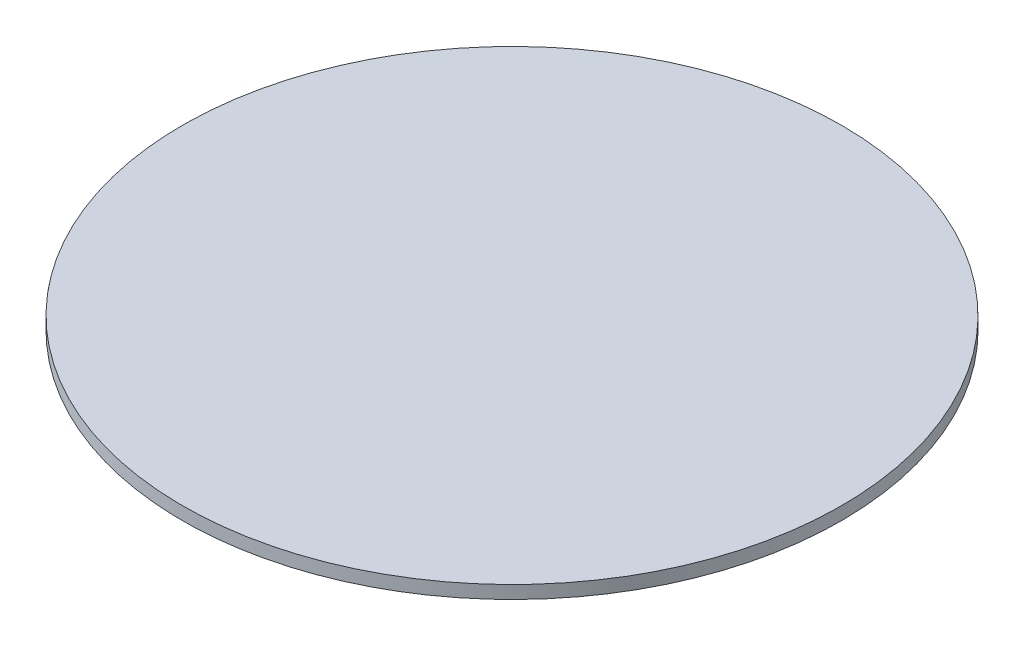
ISO-10303-21;
HEADER;
FILE_DESCRIPTION(('STEP AP214'),'2;1');
FILE_NAME('part.step','',(''),(''),'','','');
FILE_SCHEMA(('AUTOMOTIVE_DESIGN { 1 0 10303 214 1 1 1 1 }'));
ENDSEC;
DATA;
#1=APPLICATION_CONTEXT('core data for automotive mechanical design processes');
#2=APPLICATION_PROTOCOL_DEFINITION('international standard','automotive_design',2000,#1);
#3=PRODUCT_CONTEXT('',#1,'mechanical');
#4=PRODUCT('Part','Part','',(#3));
#5=PRODUCT_RELATED_PRODUCT_CATEGORY('part','',(#4));
#6=PRODUCT_DEFINITION_FORMATION('','',#4);
#7=PRODUCT_DEFINITION_CONTEXT('part definition',#1,'design');
#8=PRODUCT_DEFINITION('design','',#6,#7);
#9=PRODUCT_DEFINITION_SHAPE('','',#8);
#10=(LENGTH_UNIT() NAMED_UNIT(*) SI_UNIT(.MILLI.,.METRE.));
#11=(NAMED_UNIT(*) PLANE_ANGLE_UNIT() SI_UNIT($,.RADIAN.));
#12=(NAMED_UNIT(*) SI_UNIT($,.STERADIAN.) SOLID_ANGLE_UNIT());
#13=UNCERTAINTY_MEASURE_WITH_UNIT(LENGTH_MEASURE(1.E-05),#10,'distance_accuracy_value','');
#14=(GEOMETRIC_REPRESENTATION_CONTEXT(3) GLOBAL_UNCERTAINTY_ASSIGNED_CONTEXT((#13)) GLOBAL_UNIT_ASSIGNED_CONTEXT((#10,
#11,#12)) REPRESENTATION_CONTEXT('',''));
#15=CARTESIAN_POINT('',(0.,0.,0.));
#16=DIRECTION('',(0.,0.,1.));
#17=DIRECTION('',(1.,0.,0.));
#18=AXIS2_PLACEMENT_3D('',#15,#16,#17);
#19=CARTESIAN_POINT('',(0.,1.09527485411535,-27.7636753236815));
#20=CARTESIAN_POINT('',(-1.81711322679222,1.09527485411535,-27.7636753236815));
#21=CARTESIAN_POINT('',(-5.45133968037664,1.09527485411535,-27.4057352601502));
#22=CARTESIAN_POINT('',(-10.6931874339829,1.09527485411535,-25.8156381281191));
#23=CARTESIAN_POINT('',(-15.5241019913099,1.09527485411535,-23.2334605004011));
#24=CARTESIAN_POINT('',(-19.7584340151274,1.09527485411535,-19.7584340151274));
#25=CARTESIAN_POINT('',(-23.2334605004011,1.09527485411535,-15.5241019913099));
#26=CARTESIAN_POINT('',(-25.8156381281191,1.09527485411535,-10.6931874339829));
#27=CARTESIAN_POINT('',(-27.4057352601502,1.09527485411535,-5.45133968037665));
#28=CARTESIAN_POINT('',(-27.9426453554471,1.09527485411535,0.));
#29=CARTESIAN_POINT('',(-27.4057352601502,1.09527485411535,5.45133968037664));
#30=CARTESIAN_POINT('',(-25.8156381281192,1.09527485411535,10.6931874339829));
#31=CARTESIAN_POINT('',(-23.2334605004011,1.09527485411535,15.5241019913098));
#32=CARTESIAN_POINT('',(-19.7584340151274,1.09527485411535,19.7584340151274));
#33=CARTESIAN_POINT('',(-15.5241019913099,1.09527485411535,23.2334605004011));
#34=CARTESIAN_POINT('',(-10.6931874339829,1.09527485411535,25.8156381281192));
#35=CARTESIAN_POINT('',(-5.45133968037664,1.09527485411535,27.4057352601502));
#36=CARTESIAN_POINT('',(0.,1.09527485411535,27.9426453554471));
#37=CARTESIAN_POINT('',(5.45133968037666,1.09527485411535,27.4057352601502));
#38=CARTESIAN_POINT('',(10.6931874339829,1.09527485411535,25.8156381281192));
#39=CARTESIAN_POINT('',(15.5241019913099,1.09527485411535,23.2334605004011));
#40=CARTESIAN_POINT('',(19.7584340151274,1.09527485411535,19.7584340151274));
#41=CARTESIAN_POINT('',(23.2334605004011,1.09527485411535,15.5241019913099));
#42=CARTESIAN_POINT('',(25.8156381281191,1.09527485411535,10.6931874339829));
#43=CARTESIAN_POINT('',(27.4057352601502,1.09527485411535,5.45133968037665));
#44=CARTESIAN_POINT('',(27.9426453554471,1.09527485411535,0.));
#45=CARTESIAN_POINT('',(27.4057352601502,1.09527485411535,-5.45133968037662));
#46=CARTESIAN_POINT('',(25.8156381281191,1.09527485411535,-10.693187433983));
#47=CARTESIAN_POINT('',(23.2334605004011,1.09527485411535,-15.5241019913098));
#48=CARTESIAN_POINT('',(19.7584340151274,1.09527485411535,-19.7584340151274));
#49=CARTESIAN_POINT('',(15.5241019913099,1.09527485411535,-23.2334605004011));
#50=CARTESIAN_POINT('',(10.6931874339829,1.09527485411535,-25.8156381281191));
#51=CARTESIAN_POINT('',(5.45133968037666,1.09527485411535,-27.4057352601502));
#52=CARTESIAN_POINT('',(1.81711322679221,1.09527485411535,-27.7636753236815));
#53=CARTESIAN_POINT('',(0.,1.09527485411535,-27.7636753236815));
#54=B_SPLINE_CURVE_WITH_KNOTS('',3,(#19,#20,#21,#22,#23,#24,#25,#26,#27,#28,#29,#30,#31,#32,#33,
#34,#35,#36,#37,#38,#39,#40,#41,#42,#43,#44,#45,#46,#47,#48,#49,#50,#51,#52,#53),.UNSPECIFIED.,
.T.,.F.,(4,1,1,1,1,1,1,1,1,1,1,1,1,1,1,1,1,1,1,1,1,1,1,1,1,1,1,1,1,1,1,1,4),(0.,0.03125,0.0625,
0.09375,0.125,0.15625,0.1875,0.21875,0.25,0.28125,0.3125,0.34375,0.375,0.40625,0.4375,0.46875,
0.5,0.53125,0.5625,0.59375,0.625,0.65625,0.6875,0.71875,0.75,0.78125,0.8125,0.84375,0.875,
0.90625,0.9375,0.96875,1.),.UNSPECIFIED.);
#55=DIRECTION('',(0.,-1.,0.));
#56=VECTOR('',#55,1.);
#57=SURFACE_OF_LINEAR_EXTRUSION('',#54,#56);
#58=CARTESIAN_POINT('',(0.,1.09527485411535,-27.7636753236815));
#59=CARTESIAN_POINT('',(1.81711322679221,1.09527485411535,-27.7636753236815));
#60=CARTESIAN_POINT('',(5.45133968037666,1.09527485411535,-27.4057352601502));
#61=CARTESIAN_POINT('',(10.6931874339829,1.09527485411535,-25.8156381281191));
#62=CARTESIAN_POINT('',(15.5241019913099,1.09527485411535,-23.2334605004011));
#63=CARTESIAN_POINT('',(19.7584340151274,1.09527485411535,-19.7584340151274));
#64=CARTESIAN_POINT('',(23.2334605004011,1.09527485411535,-15.5241019913098));
#65=CARTESIAN_POINT('',(25.8156381281191,1.09527485411535,-10.693187433983));
#66=CARTESIAN_POINT('',(27.4057352601502,1.09527485411535,-5.45133968037662));
#67=CARTESIAN_POINT('',(27.9426453554471,1.09527485411535,0.));
#68=CARTESIAN_POINT('',(27.4057352601502,1.09527485411535,5.45133968037665));
#69=CARTESIAN_POINT('',(25.8156381281191,1.09527485411535,10.6931874339829));
#70=CARTESIAN_POINT('',(23.2334605004011,1.09527485411535,15.5241019913099));
#71=CARTESIAN_POINT('',(19.7584340151274,1.09527485411535,19.7584340151274));
#72=CARTESIAN_POINT('',(15.5241019913099,1.09527485411535,23.2334605004011));
#73=CARTESIAN_POINT('',(10.6931874339829,1.09527485411535,25.8156381281192));
#74=CARTESIAN_POINT('',(5.45133968037666,1.09527485411535,27.4057352601502));
#75=CARTESIAN_POINT('',(0.,1.09527485411535,27.9426453554471));
#76=CARTESIAN_POINT('',(-5.45133968037664,1.09527485411535,27.4057352601502));
#77=CARTESIAN_POINT('',(-10.6931874339829,1.09527485411535,25.8156381281192));
#78=CARTESIAN_POINT('',(-15.5241019913099,1.09527485411535,23.2334605004011));
#79=CARTESIAN_POINT('',(-19.7584340151274,1.09527485411535,19.7584340151274));
#80=CARTESIAN_POINT('',(-23.2334605004011,1.09527485411535,15.5241019913098));
#81=CARTESIAN_POINT('',(-25.8156381281192,1.09527485411535,10.6931874339829));
#82=CARTESIAN_POINT('',(-27.4057352601502,1.09527485411535,5.45133968037664));
#83=CARTESIAN_POINT('',(-27.9426453554471,1.09527485411535,0.));
#84=CARTESIAN_POINT('',(-27.4057352601502,1.09527485411535,-5.45133968037665));
#85=CARTESIAN_POINT('',(-25.8156381281191,1.09527485411535,-10.6931874339829));
#86=CARTESIAN_POINT('',(-23.2334605004011,1.09527485411535,-15.5241019913099));
#87=CARTESIAN_POINT('',(-19.7584340151274,1.09527485411535,-19.7584340151274));
#88=CARTESIAN_POINT('',(-15.5241019913099,1.09527485411535,-23.2334605004011));
#89=CARTESIAN_POINT('',(-10.6931874339829,1.09527485411535,-25.8156381281191));
#90=CARTESIAN_POINT('',(-5.45133968037664,1.09527485411535,-27.4057352601502));
#91=CARTESIAN_POINT('',(-1.81711322679222,1.09527485411535,-27.7636753236815));
#92=CARTESIAN_POINT('',(0.,1.09527485411535,-27.7636753236815));
#93=B_SPLINE_CURVE_WITH_KNOTS('',3,(#58,#59,#60,#61,#62,#63,#64,#65,#66,#67,#68,#69,#70,#71,#72,
#73,#74,#75,#76,#77,#78,#79,#80,#81,#82,#83,#84,#85,#86,#87,#88,#89,#90,#91,#92),.UNSPECIFIED.,
.T.,.F.,(4,1,1,1,1,1,1,1,1,1,1,1,1,1,1,1,1,1,1,1,1,1,1,1,1,1,1,1,1,1,1,1,4),(0.,0.03125,0.0625,
0.0937499999999999,0.125,0.15625,0.1875,0.21875,0.25,0.28125,0.3125,0.34375,0.375,0.40625,
0.4375,0.46875,0.5,0.53125,0.5625,0.59375,0.625,0.65625,0.6875,0.71875,0.75,0.78125,0.8125,
0.84375,0.875,0.90625,0.9375,0.96875,1.),.UNSPECIFIED.);
#94=CARTESIAN_POINT('',(0.,1.09527485411535,-27.7636753236815));
#95=VERTEX_POINT('',#94);
#96=EDGE_CURVE('E9',#95,#95,#93,.F.);
#97=ORIENTED_EDGE('',*,*,#96,.F.);
#98=EDGE_LOOP('',(#97));
#99=FACE_BOUND('',#98,.T.);
#100=CARTESIAN_POINT('',(0.,0.000999999999999916,-27.7636753236815));
#101=CARTESIAN_POINT('',(-0.363424100673895,0.000999999999999645,-27.7636753059347));
#102=CARTESIAN_POINT('',(-0.726846612717625,0.000999999999999744,-27.7565164667435));
#103=CARTESIAN_POINT('',(-1.45313299717864,0.00100000000000009,-27.7279363009702));
#104=CARTESIAN_POINT('',(-1.81599686591457,0.00100000000000033,-27.7065148808001));
#105=CARTESIAN_POINT('',(-2.540606941983,0.00100000000000037,-27.6494646135932));
#106=CARTESIAN_POINT('',(-2.90235314553331,0.00100000000000016,-27.6138357185312));
#107=CARTESIAN_POINT('',(-3.6241698322117,0.00100000000000011,-27.5284253916523));
#108=CARTESIAN_POINT('',(-3.98424032100006,0.00100000000000026,-27.4786440076757));
#109=CARTESIAN_POINT('',(-4.70214752337475,0.00100000000000044,-27.3649834822098));
#110=CARTESIAN_POINT('',(-5.05998425160316,0.00100000000000047,-27.3011044332294));
#111=CARTESIAN_POINT('',(-5.7728644668933,0.00100000000000023,-27.159303741493));
#112=CARTESIAN_POINT('',(-6.12790795395503,0.000999999999999958,-27.0813820987369));
#113=CARTESIAN_POINT('',(-6.83466371635391,0.000999999999999874,-26.9116595429814));
#114=CARTESIAN_POINT('',(-7.18637596981687,0.00100000000000006,-26.8198585389116));
#115=CARTESIAN_POINT('',(-7.88593278259689,0.0010000000000002,-26.622540091713));
#116=CARTESIAN_POINT('',(-8.23377732883593,0.00100000000000016,-26.5170226022194));
#117=CARTESIAN_POINT('',(-8.92506181663289,0.00100000000000011,-26.2924339534261));
#118=CARTESIAN_POINT('',(-9.26850177307571,0.0010000000000001,-26.173362839943));
#119=CARTESIAN_POINT('',(-9.95044051209502,0.00100000000000017,-25.9218295243386));
#120=CARTESIAN_POINT('',(-10.2889393270797,0.00100000000000024,-25.7893674100922));
#121=CARTESIAN_POINT('',(-10.960457808793,0.00100000000000002,-25.5112153475838));
#122=CARTESIAN_POINT('',(-11.2934774755215,0.000999999999999724,-25.3655253993217));
#123=CARTESIAN_POINT('',(-11.9535418954025,0.000999999999999674,-25.0611828057565));
#124=CARTESIAN_POINT('',(-12.2805866093342,0.000999999999999923,-24.9025300754004));
#125=CARTESIAN_POINT('',(-12.9282067148889,0.000999999999999909,-24.5725262829232));
#126=CARTESIAN_POINT('',(-13.2487820846399,0.000999999999999647,-24.4011751778797));
#127=CARTESIAN_POINT('',(-13.8829686629803,0.000999999999999751,-24.0460390236789));
#128=CARTESIAN_POINT('',(-14.196579895107,0.00100000000000012,-23.862254016554));
#129=CARTESIAN_POINT('',(-14.8163436569476,0.00100000000000015,-23.4825141948848));
#130=CARTESIAN_POINT('',(-15.1224962355906,0.000999999999999815,-23.2865594602044));
#131=CARTESIAN_POINT('',(-15.726846902526,0.000999999999999583,-22.8827452547459));
#132=CARTESIAN_POINT('',(-16.0250449908184,0.000999999999999684,-22.6748857839678));
#133=CARTESIAN_POINT('',(-16.6130521633747,0.00100000000000015,-22.2476188677731));
#134=CARTESIAN_POINT('',(-16.9028611925783,0.00100000000000051,-22.0282113465894));
#135=CARTESIAN_POINT('',(-17.4736569132584,0.00100000000000062,-21.5782040695138));
#136=CARTESIAN_POINT('',(-17.7546435749093,0.00100000000000037,-21.3476042757912));
#137=CARTESIAN_POINT('',(-18.3073608092923,0.00100000000000033,-20.8755682994253));
#138=CARTESIAN_POINT('',(-18.5790914133095,0.00100000000000054,-20.6341321534149));
#139=CARTESIAN_POINT('',(-19.1128630241583,0.00100000000000059,-20.1407790140674));
#140=CARTESIAN_POINT('',(-19.3749040945595,0.00100000000000043,-19.8888620895141));
#141=CARTESIAN_POINT('',(-19.888862089514,0.00100000000000027,-19.3749040945595));
#142=CARTESIAN_POINT('',(-20.1407790140674,0.00100000000000026,-19.1128630241583));
#143=CARTESIAN_POINT('',(-20.6341321534149,0.00100000000000044,-18.5790914133095));
#144=CARTESIAN_POINT('',(-20.8755682994252,0.00100000000000062,-18.3073608092923));
#145=CARTESIAN_POINT('',(-21.3476042757911,0.00100000000000051,-17.7546435749093));
#146=CARTESIAN_POINT('',(-21.5782040695138,0.00100000000000022,-17.4736569132584));
#147=CARTESIAN_POINT('',(-22.0282113465894,0.00100000000000004,-16.9028611925783));
#148=CARTESIAN_POINT('',(-22.2476188677731,0.00100000000000015,-16.6130521633747));
#149=CARTESIAN_POINT('',(-22.6748857839677,0.00100000000000011,-16.0250449908184));
#150=CARTESIAN_POINT('',(-22.8827452547459,0.00099999999999997,-15.726846902526));
#151=CARTESIAN_POINT('',(-23.2865594602044,0.000999999999999862,-15.1224962355906));
#152=CARTESIAN_POINT('',(-23.4825141948848,0.000999999999999897,-14.8163436569476));
#153=CARTESIAN_POINT('',(-23.8622540165539,0.000999999999999934,-14.196579895107));
#154=CARTESIAN_POINT('',(-24.0460390236789,0.000999999999999935,-13.8829686629803));
#155=CARTESIAN_POINT('',(-24.4011751778797,0.000999999999999897,-13.2487820846399));
#156=CARTESIAN_POINT('',(-24.5725262829232,0.000999999999999857,-12.9282067148888));
#157=CARTESIAN_POINT('',(-24.9025300754004,0.000999999999999975,-12.2805866093343));
#158=CARTESIAN_POINT('',(-25.0611828057565,0.00100000000000013,-11.953541895403));
#159=CARTESIAN_POINT('',(-25.3655253993217,0.00100000000000013,-11.293477475521));
#160=CARTESIAN_POINT('',(-25.5112153475838,0.000999999999999975,-10.9604578087912));
#161=CARTESIAN_POINT('',(-25.7893674100922,0.000999999999999857,-10.2889393270815));
#162=CARTESIAN_POINT('',(-25.9218295243385,0.000999999999999896,-9.95044051210157));
#163=CARTESIAN_POINT('',(-26.1733628399431,0.000999999999999935,-9.26850177306921));
#164=CARTESIAN_POINT('',(-26.2924339534265,0.000999999999999935,-8.92506181660855));
#165=CARTESIAN_POINT('',(-26.517022602219,0.000999999999999897,-8.23377732886033));
#166=CARTESIAN_POINT('',(-26.6225400917113,0.000999999999999861,-7.88593278268787));
#167=CARTESIAN_POINT('',(-26.8198585389134,0.000999999999999971,-7.18637596972594));
#168=CARTESIAN_POINT('',(-26.911659542988,0.00100000000000012,-6.83466371601448));
#169=CARTESIAN_POINT('',(-27.0813820987303,0.00100000000000015,-6.12790795429451));
#170=CARTESIAN_POINT('',(-27.1593037414684,0.00100000000000003,-5.77286446816018));
#171=CARTESIAN_POINT('',(-27.3011044332539,0.000999999999999798,-5.05998425033634));
#172=CARTESIAN_POINT('',(-27.3649834823013,0.000999999999999678,-4.70214751864683));
#173=CARTESIAN_POINT('',(-27.4786440075842,0.000999999999999721,-3.98424032572806));
#174=CARTESIAN_POINT('',(-27.5284253913109,0.000999999999999884,-3.62416984985681));
#175=CARTESIAN_POINT('',(-27.6138357188726,0.000999999999999948,-2.90235312788819));
#176=CARTESIAN_POINT('',(-27.6494646148674,0.000999999999999848,-2.54060687613032));
#177=CARTESIAN_POINT('',(-27.706514879526,0.000999999999999984,-1.81599693176707));
#178=CARTESIAN_POINT('',(-27.7279362962149,0.00100000000000022,-1.45313324294312));
#179=CARTESIAN_POINT('',(-27.7565164714988,0.00100000000000048,-0.726846366954814));
#180=CARTESIAN_POINT('',(-27.7636753236815,0.0010000000000005,-0.363423183477412));
#181=CARTESIAN_POINT('',(-27.7636753236815,0.0010000000000002,0.363423183477392));
#182=CARTESIAN_POINT('',(-27.7565164714988,0.000999999999999884,0.726846366954794));
#183=CARTESIAN_POINT('',(-27.7279362962149,0.000999999999999948,1.4531332429431));
#184=CARTESIAN_POINT('',(-27.706514879526,0.00100000000000033,1.81599693176705));
#185=CARTESIAN_POINT('',(-27.6494646148674,0.00100000000000037,2.5406068761303));
#186=CARTESIAN_POINT('',(-27.6138357188726,0.00100000000000003,2.90235312788817));
#187=CARTESIAN_POINT('',(-27.5284253913109,0.000999999999999806,3.62416984985679));
#188=CARTESIAN_POINT('',(-27.4786440075842,0.000999999999999929,3.98424032572804));
#189=CARTESIAN_POINT('',(-27.3649834823013,0.000999999999999903,4.70214751864681));
#190=CARTESIAN_POINT('',(-27.3011044332539,0.000999999999999755,5.05998425033632));
#191=CARTESIAN_POINT('',(-27.1593037414684,0.000999999999999643,5.77286446816016));
#192=CARTESIAN_POINT('',(-27.0813820987303,0.000999999999999679,6.12790795429448));
#193=CARTESIAN_POINT('',(-26.911659542988,0.000999999999999719,6.83466371601446));
#194=CARTESIAN_POINT('',(-26.8198585389134,0.000999999999999723,7.18637596972592));
#195=CARTESIAN_POINT('',(-26.6225400917113,0.000999999999999675,7.88593278268785));
#196=CARTESIAN_POINT('',(-26.517022602219,0.000999999999999623,8.23377732886031));
#197=CARTESIAN_POINT('',(-26.2924339534265,0.000999999999999776,8.92506181660853));
#198=CARTESIAN_POINT('',(-26.1733628399431,0.000999999999999981,9.26850177306919));
#199=CARTESIAN_POINT('',(-25.9218295243385,0.00100000000000028,9.95044051210155));
#200=CARTESIAN_POINT('',(-25.7893674100922,0.00100000000000038,10.2889393270815));
#201=CARTESIAN_POINT('',(-25.5112153475838,0.00100000000000032,10.9604578087912));
#202=CARTESIAN_POINT('',(-25.3655253993218,0.00100000000000015,11.293477475521));
#203=CARTESIAN_POINT('',(-25.0611828057565,0.00100000000000012,11.953541895403));
#204=CARTESIAN_POINT('',(-24.9025300754004,0.00100000000000025,12.2805866093343));
#205=CARTESIAN_POINT('',(-24.5725262829232,0.00100000000000045,12.9282067148888));
#206=CARTESIAN_POINT('',(-24.4011751778797,0.00100000000000052,13.2487820846398));
#207=CARTESIAN_POINT('',(-24.0460390236789,0.00100000000000061,13.8829686629803));
#208=CARTESIAN_POINT('',(-23.862254016554,0.00100000000000062,14.196579895107));
#209=CARTESIAN_POINT('',(-23.4825141948848,0.00100000000000051,14.8163436569476));
#210=CARTESIAN_POINT('',(-23.2865594602044,0.00100000000000039,15.1224962355906));
#211=CARTESIAN_POINT('',(-22.8827452547459,0.00100000000000031,15.726846902526));
#212=CARTESIAN_POINT('',(-22.6748857839677,0.00100000000000037,16.0250449908184));
#213=CARTESIAN_POINT('',(-22.2476188677731,0.00100000000000033,16.6130521633747));
#214=CARTESIAN_POINT('',(-22.0282113465894,0.00100000000000024,16.9028611925783));
#215=CARTESIAN_POINT('',(-21.5782040695138,0.00100000000000002,17.4736569132584));
#216=CARTESIAN_POINT('',(-21.3476042757911,0.000999999999999895,17.7546435749093));
#217=CARTESIAN_POINT('',(-20.8755682994252,0.000999999999999937,18.3073608092923));
#218=CARTESIAN_POINT('',(-20.6341321534149,0.00100000000000011,18.5790914133095));
#219=CARTESIAN_POINT('',(-20.1407790140674,0.00100000000000016,19.1128630241583));
#220=CARTESIAN_POINT('',(-19.8888620895141,0.00100000000000004,19.3749040945595));
#221=CARTESIAN_POINT('',(-19.3749040945595,0.000999999999999796,19.8888620895141));
#222=CARTESIAN_POINT('',(-19.1128630241583,0.000999999999999678,20.1407790140674));
#223=CARTESIAN_POINT('',(-18.5790914133095,0.00099999999999972,20.6341321534149));
#224=CARTESIAN_POINT('',(-18.3073608092923,0.000999999999999878,20.8755682994252));
#225=CARTESIAN_POINT('',(-17.7546435749093,0.000999999999999954,21.3476042757911));
#226=CARTESIAN_POINT('',(-17.4736569132584,0.000999999999999871,21.5782040695138));
#227=CARTESIAN_POINT('',(-16.9028611925783,0.000999999999999961,22.0282113465894));
#228=CARTESIAN_POINT('',(-16.6130521633747,0.00100000000000013,22.2476188677731));
#229=CARTESIAN_POINT('',(-16.0250449908184,0.00100000000000013,22.6748857839677));
#230=CARTESIAN_POINT('',(-15.726846902526,0.000999999999999953,22.8827452547459));
#231=CARTESIAN_POINT('',(-15.1224962355906,0.000999999999999879,23.2865594602044));
#232=CARTESIAN_POINT('',(-14.8163436569476,0.000999999999999983,23.4825141948848));
#233=CARTESIAN_POINT('',(-14.196579895107,0.000999999999999848,23.862254016554));
#234=CARTESIAN_POINT('',(-13.8829686629803,0.000999999999999609,24.0460390236789));
#235=CARTESIAN_POINT('',(-13.2487820846399,0.000999999999999789,24.4011751778797));
#236=CARTESIAN_POINT('',(-12.9282067148888,0.00100000000000021,24.5725262829232));
#237=CARTESIAN_POINT('',(-12.2805866093343,0.00100000000000049,24.9025300754004));
#238=CARTESIAN_POINT('',(-11.953541895403,0.00100000000000036,25.0611828057565));
#239=CARTESIAN_POINT('',(-11.293477475521,0.00100000000000034,25.3655253993218));
#240=CARTESIAN_POINT('',(-10.9604578087912,0.00100000000000046,25.5112153475838));
#241=CARTESIAN_POINT('',(-10.2889393270815,0.00100000000000024,25.7893674100922));
#242=CARTESIAN_POINT('',(-9.95044051210155,0.000999999999999902,25.9218295243385));
#243=CARTESIAN_POINT('',(-9.26850177306919,0.00099999999999993,26.1733628399431));
#244=CARTESIAN_POINT('',(-8.92506181660853,0.0010000000000003,26.2924339534266));
#245=CARTESIAN_POINT('',(-8.23377732886031,0.0010000000000004,26.517022602219));
#246=CARTESIAN_POINT('',(-7.88593278268786,0.00100000000000014,26.6225400917113));
#247=CARTESIAN_POINT('',(-7.18637596972593,0.00100000000000012,26.8198585389134));
#248=CARTESIAN_POINT('',(-6.83466371601447,0.00100000000000037,26.911659542988));
#249=CARTESIAN_POINT('',(-6.12790795429449,0.00100000000000033,27.0813820987303));
#250=CARTESIAN_POINT('',(-5.77286446816016,0.00100000000000004,27.1593037414684));
#251=CARTESIAN_POINT('',(-5.05998425033632,0.000999999999999789,27.3011044332539));
#252=CARTESIAN_POINT('',(-4.70214751864681,0.000999999999999821,27.3649834823013));
#253=CARTESIAN_POINT('',(-3.98424032572804,0.00100000000000001,27.4786440075842));
#254=CARTESIAN_POINT('',(-3.62416984985679,0.00100000000000017,27.5284253913109));
#255=CARTESIAN_POINT('',(-2.90235312788818,0.0010000000000001,27.6138357188726));
#256=CARTESIAN_POINT('',(-2.5406068761303,0.000999999999999872,27.6494646148674));
#257=CARTESIAN_POINT('',(-1.81599693176706,0.00099999999999996,27.706514879526));
#258=CARTESIAN_POINT('',(-1.4531332429431,0.00100000000000027,27.7279362962149));
#259=CARTESIAN_POINT('',(-0.726846366954812,0.00100000000000043,27.7565164714988));
#260=CARTESIAN_POINT('',(-0.363423183477422,0.00100000000000027,27.7636753236815));
#261=CARTESIAN_POINT('',(0.363423183477371,0.001,27.7636753236815));
#262=CARTESIAN_POINT('',(0.726846366954774,0.000999999999999896,27.7565164714988));
#263=CARTESIAN_POINT('',(1.45313324294308,0.000999999999999936,27.7279362962149));
#264=CARTESIAN_POINT('',(1.81599693176704,0.00100000000000008,27.706514879526));
#265=CARTESIAN_POINT('',(2.54060687613029,0.00100000000000018,27.6494646148674));
#266=CARTESIAN_POINT('',(2.90235312788816,0.00100000000000015,27.6138357188726));
#267=CARTESIAN_POINT('',(3.62416984985678,0.00100000000000012,27.5284253913109));
#268=CARTESIAN_POINT('',(3.98424032572803,0.00100000000000013,27.4786440075842));
#269=CARTESIAN_POINT('',(4.7021475186468,0.00100000000000013,27.3649834823012));
#270=CARTESIAN_POINT('',(5.05998425033632,0.00100000000000011,27.3011044332539));
#271=CARTESIAN_POINT('',(5.77286446816015,0.00100000000000015,27.1593037414684));
#272=CARTESIAN_POINT('',(6.12790795429448,0.0010000000000002,27.0813820987303));
#273=CARTESIAN_POINT('',(6.83466371601447,0.00100000000000006,26.911659542988));
#274=CARTESIAN_POINT('',(7.18637596972594,0.000999999999999869,26.8198585389134));
#275=CARTESIAN_POINT('',(7.88593278268787,0.000999999999999963,26.6225400917113));
#276=CARTESIAN_POINT('',(8.23377732886031,0.00100000000000025,26.517022602219));
#277=CARTESIAN_POINT('',(8.92506181660852,0.00100000000000045,26.2924339534265));
#278=CARTESIAN_POINT('',(9.26850177306918,0.00100000000000037,26.1733628399431));
#279=CARTESIAN_POINT('',(9.95044051210154,0.00100000000000033,25.9218295243385));
#280=CARTESIAN_POINT('',(10.2889393270815,0.00100000000000039,25.7893674100922));
#281=CARTESIAN_POINT('',(10.9604578087912,0.00100000000000031,25.5112153475838));
#282=CARTESIAN_POINT('',(11.293477475521,0.00100000000000018,25.3655253993218));
#283=CARTESIAN_POINT('',(11.953541895403,0.00100000000000008,25.0611828057565));
#284=CARTESIAN_POINT('',(12.2805866093343,0.00100000000000011,24.9025300754004));
#285=CARTESIAN_POINT('',(12.9282067148888,0.00100000000000016,24.5725262829232));
#286=CARTESIAN_POINT('',(13.2487820846398,0.00100000000000019,24.4011751778797));
#287=CARTESIAN_POINT('',(13.8829686629803,0.00100000000000008,24.0460390236789));
#288=CARTESIAN_POINT('',(14.196579895107,0.000999999999999945,23.862254016554));
#289=CARTESIAN_POINT('',(14.8163436569476,0.000999999999999887,23.4825141948848));
#290=CARTESIAN_POINT('',(15.1224962355906,0.000999999999999963,23.2865594602044));
#291=CARTESIAN_POINT('',(15.726846902526,0.000999999999999869,22.8827452547459));
#292=CARTESIAN_POINT('',(16.0250449908184,0.0009999999999997,22.6748857839677));
#293=CARTESIAN_POINT('',(16.6130521633747,0.000999999999999698,22.2476188677731));
#294=CARTESIAN_POINT('',(16.9028611925783,0.000999999999999867,22.0282113465894));
#295=CARTESIAN_POINT('',(17.4736569132584,0.000999999999999965,21.5782040695138));
#296=CARTESIAN_POINT('',(17.7546435749093,0.000999999999999894,21.3476042757912));
#297=CARTESIAN_POINT('',(18.3073608092923,0.000999999999999938,20.8755682994253));
#298=CARTESIAN_POINT('',(18.5790914133095,0.00100000000000005,20.6341321534149));
#299=CARTESIAN_POINT('',(19.1128630241583,0.00100000000000021,20.1407790140674));
#300=CARTESIAN_POINT('',(19.3749040945595,0.00100000000000026,19.8888620895141));
#301=CARTESIAN_POINT('',(19.888862089514,0.001,19.3749040945595));
#302=CARTESIAN_POINT('',(20.1407790140674,0.000999999999999686,19.1128630241583));
#303=CARTESIAN_POINT('',(20.6341321534148,0.000999999999999712,18.5790914133095));
#304=CARTESIAN_POINT('',(20.8755682994252,0.00100000000000005,18.3073608092924));
#305=CARTESIAN_POINT('',(21.3476042757911,0.00100000000000021,17.7546435749093));
#306=CARTESIAN_POINT('',(21.5782040695138,0.00100000000000004,17.4736569132584));
#307=CARTESIAN_POINT('',(22.0282113465894,0.000999999999999794,16.9028611925783));
#308=CARTESIAN_POINT('',(22.2476188677731,0.000999999999999727,16.6130521633747));
#309=CARTESIAN_POINT('',(22.6748857839677,0.000999999999999672,16.0250449908184));
#310=CARTESIAN_POINT('',(22.8827452547459,0.000999999999999684,15.726846902526));
#311=CARTESIAN_POINT('',(23.2865594602044,0.000999999999999714,15.1224962355906));
#312=CARTESIAN_POINT('',(23.4825141948848,0.000999999999999733,14.8163436569476));
#313=CARTESIAN_POINT('',(23.8622540165539,0.000999999999999665,14.196579895107));
#314=CARTESIAN_POINT('',(24.0460390236788,0.000999999999999579,13.8829686629804));
#315=CARTESIAN_POINT('',(24.4011751778796,0.000999999999999819,13.2487820846399));
#316=CARTESIAN_POINT('',(24.5725262829231,0.00100000000000014,12.9282067148888));
#317=CARTESIAN_POINT('',(24.9025300754003,0.00100000000000012,12.2805866093344));
#318=CARTESIAN_POINT('',(25.0611828057565,0.000999999999999776,11.953541895403));
#319=CARTESIAN_POINT('',(25.3655253993217,0.000999999999999623,11.293477475521));
#320=CARTESIAN_POINT('',(25.5112153475838,0.000999999999999817,10.9604578087913));
#321=CARTESIAN_POINT('',(25.7893674100922,0.00100000000000002,10.2889393270815));
#322=CARTESIAN_POINT('',(25.9218295243385,0.00100000000000002,9.95044051210157));
#323=CARTESIAN_POINT('',(26.1733628399431,0.00100000000000025,9.26850177306921));
#324=CARTESIAN_POINT('',(26.2924339534265,0.00100000000000046,8.92506181660855));
#325=CARTESIAN_POINT('',(26.517022602219,0.00100000000000067,8.23377732886034));
#326=CARTESIAN_POINT('',(26.6225400917113,0.00100000000000065,7.8859327826879));
#327=CARTESIAN_POINT('',(26.8198585389134,0.00100000000000048,7.18637596972597));
#328=CARTESIAN_POINT('',(26.911659542988,0.00100000000000033,6.8346637160145));
#329=CARTESIAN_POINT('',(27.0813820987303,0.00100000000000037,6.12790795429451));
#330=CARTESIAN_POINT('',(27.1593037414684,0.00100000000000057,5.77286446816018));
#331=CARTESIAN_POINT('',(27.3011044332539,0.00100000000000056,5.05998425033635));
#332=CARTESIAN_POINT('',(27.3649834823012,0.00100000000000036,4.70214751864683));
#333=CARTESIAN_POINT('',(27.4786440075842,0.00100000000000034,3.98424032572807));
#334=CARTESIAN_POINT('',(27.5284253913109,0.00100000000000051,3.62416984985681));
#335=CARTESIAN_POINT('',(27.6138357188726,0.00100000000000063,2.9023531278882));
#336=CARTESIAN_POINT('',(27.6494646148674,0.00100000000000058,2.54060687613033));
#337=CARTESIAN_POINT('',(27.706514879526,0.00100000000000056,1.81599693176708));
#338=CARTESIAN_POINT('',(27.7279362962149,0.00100000000000059,1.45313324294313));
#339=CARTESIAN_POINT('',(27.7565164714988,0.00100000000000054,0.726846366954825));
#340=CARTESIAN_POINT('',(27.7636753236815,0.00100000000000046,0.363423183477424));
#341=CARTESIAN_POINT('',(27.7636753236815,0.00100000000000024,-0.363423183477378));
#342=CARTESIAN_POINT('',(27.7565164714988,0.00100000000000012,-0.726846366954779));
#343=CARTESIAN_POINT('',(27.7279362962149,0.00100000000000015,-1.45313324294308));
#344=CARTESIAN_POINT('',(27.706514879526,0.00100000000000031,-1.81599693176704));
#345=CARTESIAN_POINT('',(27.6494646148674,0.00100000000000039,-2.54060687613028));
#346=CARTESIAN_POINT('',(27.6138357188726,0.0010000000000003,-2.90235312788815));
#347=CARTESIAN_POINT('',(27.5284253913109,0.0010000000000004,-3.62416984985677));
#348=CARTESIAN_POINT('',(27.4786440075842,0.0010000000000006,-3.98424032572802));
#349=CARTESIAN_POINT('',(27.3649834823013,0.00100000000000053,-4.70214751864679));
#350=CARTESIAN_POINT('',(27.3011044332539,0.00100000000000027,-5.0599842503363));
#351=CARTESIAN_POINT('',(27.1593037414685,0.000999999999999999,-5.77286446816014));
#352=CARTESIAN_POINT('',(27.0813820987303,0.000999999999999997,-6.12790795429447));
#353=CARTESIAN_POINT('',(26.911659542988,0.000999999999999835,-6.83466371601446));
#354=CARTESIAN_POINT('',(26.8198585389134,0.000999999999999675,-7.18637596972593));
#355=CARTESIAN_POINT('',(26.6225400917113,0.000999999999999723,-7.88593278268787));
#356=CARTESIAN_POINT('',(26.517022602219,0.000999999999999931,-8.23377732886031));
#357=CARTESIAN_POINT('',(26.2924339534265,0.00100000000000033,-8.92506181660852));
#358=CARTESIAN_POINT('',(26.1733628399431,0.00100000000000053,-9.26850177306918));
#359=CARTESIAN_POINT('',(25.9218295243385,0.0010000000000006,-9.95044051210155));
#360=CARTESIAN_POINT('',(25.7893674100922,0.00100000000000048,-10.2889393270815));
#361=CARTESIAN_POINT('',(25.5112153475838,0.00100000000000022,-10.9604578087912));
#362=CARTESIAN_POINT('',(25.3655253993217,0.00100000000000008,-11.293477475521));
#363=CARTESIAN_POINT('',(25.0611828057565,0.00100000000000019,-11.953541895403));
#364=CARTESIAN_POINT('',(24.9025300754004,0.00100000000000044,-12.2805866093343));
#365=CARTESIAN_POINT('',(24.5725262829232,0.0010000000000007,-12.9282067148888));
#366=CARTESIAN_POINT('',(24.4011751778797,0.00100000000000071,-13.2487820846399));
#367=CARTESIAN_POINT('',(24.0460390236789,0.00100000000000043,-13.8829686629803));
#368=CARTESIAN_POINT('',(23.8622540165539,0.00100000000000014,-14.196579895107));
#369=CARTESIAN_POINT('',(23.4825141948848,0.00100000000000013,-14.8163436569476));
#370=CARTESIAN_POINT('',(23.2865594602044,0.00100000000000041,-15.1224962355906));
#371=CARTESIAN_POINT('',(22.8827452547459,0.00100000000000072,-15.726846902526));
#372=CARTESIAN_POINT('',(22.6748857839678,0.00100000000000074,-16.0250449908184));
#373=CARTESIAN_POINT('',(22.2476188677731,0.0010000000000004,-16.6130521633747));
#374=CARTESIAN_POINT('',(22.0282113465894,0.00100000000000004,-16.9028611925783));
#375=CARTESIAN_POINT('',(21.5782040695138,0.000999999999999795,-17.4736569132584));
#376=CARTESIAN_POINT('',(21.3476042757912,0.000999999999999912,-17.7546435749093));
#377=CARTESIAN_POINT('',(20.8755682994253,0.00099999999999992,-18.3073608092923));
#378=CARTESIAN_POINT('',(20.6341321534149,0.00099999999999981,-18.5790914133095));
#379=CARTESIAN_POINT('',(20.1407790140674,0.00100000000000002,-19.1128630241583));
#380=CARTESIAN_POINT('',(19.8888620895141,0.00100000000000034,-19.3749040945595));
#381=CARTESIAN_POINT('',(19.3749040945595,0.00100000000000036,-19.888862089514));
#382=CARTESIAN_POINT('',(19.1128630241584,0.00100000000000005,-20.1407790140674));
#383=CARTESIAN_POINT('',(18.5790914133096,0.000999999999999781,-20.6341321534148));
#384=CARTESIAN_POINT('',(18.3073608092924,0.000999999999999817,-20.8755682994252));
#385=CARTESIAN_POINT('',(17.7546435749094,0.00100000000000001,-21.3476042757911));
#386=CARTESIAN_POINT('',(17.4736569132584,0.00100000000000018,-21.5782040695138));
#387=CARTESIAN_POINT('',(16.9028611925783,0.00100000000000052,-22.0282113465894));
#388=CARTESIAN_POINT('',(16.6130521633747,0.00100000000000071,-22.247618867773));
#389=CARTESIAN_POINT('',(16.0250449908185,0.00100000000000043,-22.6748857839677));
#390=CARTESIAN_POINT('',(15.7268469025261,0.00099999999999996,-22.8827452547459));
#391=CARTESIAN_POINT('',(15.1224962355906,0.000999999999999872,-23.2865594602044));
#392=CARTESIAN_POINT('',(14.8163436569476,0.00100000000000025,-23.4825141948848));
#393=CARTESIAN_POINT('',(14.196579895107,0.00100000000000045,-23.8622540165539));
#394=CARTESIAN_POINT('',(13.8829686629803,0.00100000000000028,-24.0460390236788));
#395=CARTESIAN_POINT('',(13.2487820846399,0.00099999999999999,-24.4011751778796));
#396=CARTESIAN_POINT('',(12.9282067148889,0.000999999999999881,-24.5725262829231));
#397=CARTESIAN_POINT('',(12.2805866093342,0.000999999999999951,-24.9025300754003));
#398=CARTESIAN_POINT('',(11.9535418954026,0.00100000000000013,-25.0611828057565));
#399=CARTESIAN_POINT('',(11.2934774755215,0.00100000000000013,-25.3655253993217));
#400=CARTESIAN_POINT('',(10.960457808793,0.000999999999999958,-25.5112153475838));
#401=CARTESIAN_POINT('',(10.2889393270798,0.000999999999999874,-25.7893674100922));
#402=CARTESIAN_POINT('',(9.95044051209508,0.000999999999999965,-25.9218295243386));
#403=CARTESIAN_POINT('',(9.26850177307579,0.000999999999999867,-26.1733628399429));
#404=CARTESIAN_POINT('',(8.92506181663297,0.000999999999999678,-26.2924339534261));
#405=CARTESIAN_POINT('',(8.23377732883601,0.00099999999999972,-26.5170226022194));
#406=CARTESIAN_POINT('',(7.88593278259699,0.000999999999999951,-26.622540091713));
#407=CARTESIAN_POINT('',(7.18637596981697,0.00100000000000031,-26.8198585389116));
#408=CARTESIAN_POINT('',(6.834663716354,0.00100000000000045,-26.9116595429814));
#409=CARTESIAN_POINT('',(6.1279079539551,0.00100000000000025,-27.0813820987369));
#410=CARTESIAN_POINT('',(5.77286446689338,0.00099999999999993,-27.159303741493));
#411=CARTESIAN_POINT('',(5.05998425160323,0.000999999999999902,-27.3011044332294));
#412=CARTESIAN_POINT('',(4.70214752337481,0.0010000000000002,-27.3649834822098));
#413=CARTESIAN_POINT('',(3.98424032100013,0.0010000000000005,-27.4786440076757));
#414=CARTESIAN_POINT('',(3.62416983221176,0.00100000000000051,-27.5284253916523));
#415=CARTESIAN_POINT('',(2.90235314553337,0.00100000000000019,-27.6138357185312));
#416=CARTESIAN_POINT('',(2.54060694198306,0.000999999999999876,-27.6494646135932));
#417=CARTESIAN_POINT('',(1.81599686591462,0.000999999999999955,-27.7065148808001));
#418=CARTESIAN_POINT('',(1.4531329971787,0.00100000000000035,-27.7279363009702));
#419=CARTESIAN_POINT('',(0.726846612717677,0.00100000000000078,-27.7565164667435));
#420=CARTESIAN_POINT('',(0.363424100673944,0.00100000000000082,-27.7636753059347));
#421=CARTESIAN_POINT('',(0.,0.00100000000000013,-27.7636753236815));
#422=B_SPLINE_CURVE_WITH_KNOTS('',3,(#100,#101,#102,#103,#104,#105,#106,#107,#108,#109,#110,
#111,#112,#113,#114,#115,#116,#117,#118,#119,#120,#121,#122,#123,#124,#125,#126,#127,#128,#129,
#130,#131,#132,#133,#134,#135,#136,#137,#138,#139,#140,#141,#142,#143,#144,#145,#146,#147,#148,
#149,#150,#151,#152,#153,#154,#155,#156,#157,#158,#159,#160,#161,#162,#163,#164,#165,#166,#167,
#168,#169,#170,#171,#172,#173,#174,#175,#176,#177,#178,#179,#180,#181,#182,#183,#184,#185,#186,
#187,#188,#189,#190,#191,#192,#193,#194,#195,#196,#197,#198,#199,#200,#201,#202,#203,#204,#205,
#206,#207,#208,#209,#210,#211,#212,#213,#214,#215,#216,#217,#218,#219,#220,#221,#222,#223,#224,
#225,#226,#227,#228,#229,#230,#231,#232,#233,#234,#235,#236,#237,#238,#239,#240,#241,#242,#243,
#244,#245,#246,#247,#248,#249,#250,#251,#252,#253,#254,#255,#256,#257,#258,#259,#260,#261,#262,
#263,#264,#265,#266,#267,#268,#269,#270,#271,#272,#273,#274,#275,#276,#277,#278,#279,#280,#281,
#282,#283,#284,#285,#286,#287,#288,#289,#290,#291,#292,#293,#294,#295,#296,#297,#298,#299,#300,
#301,#302,#303,#304,#305,#306,#307,#308,#309,#310,#311,#312,#313,#314,#315,#316,#317,#318,#319,
#320,#321,#322,#323,#324,#325,#326,#327,#328,#329,#330,#331,#332,#333,#334,#335,#336,#337,#338,
#339,#340,#341,#342,#343,#344,#345,#346,#347,#348,#349,#350,#351,#352,#353,#354,#355,#356,#357,
#358,#359,#360,#361,#362,#363,#364,#365,#366,#367,#368,#369,#370,#371,#372,#373,#374,#375,#376,
#377,#378,#379,#380,#381,#382,#383,#384,#385,#386,#387,#388,#389,#390,#391,#392,#393,#394,#395,
#396,#397,#398,#399,#400,#401,#402,#403,#404,#405,#406,#407,#408,#409,#410,#411,#412,#413,#414,
#415,#416,#417,#418,#419,#420,#421),.UNSPECIFIED.,.F.,.F.,(4,2,2,2,2,2,2,2,2,2,2,2,2,2,2,2,2,2,
2,2,2,2,2,2,2,2,2,2,2,2,2,2,2,2,2,2,2,2,2,2,2,2,2,2,2,2,2,2,2,2,2,2,2,2,2,2,2,2,2,2,2,2,2,2,2,2,
2,2,2,2,2,2,2,2,2,2,2,2,2,2,2,2,2,2,2,2,2,2,2,2,2,2,2,2,2,2,2,2,2,2,2,2,2,2,2,2,2,2,2,2,2,2,2,2,
2,2,2,2,2,2,2,2,2,2,2,2,2,2,2,2,2,2,2,2,2,2,2,2,2,2,2,2,2,2,2,2,2,2,2,2,2,2,2,2,2,2,2,2,2,2,4),
(0.,1.09019962969255,2.18040641311252,3.27061688176776,4.36082366518774,5.45102329488029,
6.54122292457284,7.63142970799282,8.72164017664805,9.81184696006803,10.9020465897606,
11.9922462194531,13.0824530028731,14.1726634715283,15.2628702549483,16.3530698846409,
17.4432695143334,18.5334762977534,19.6236867664086,20.7138935498286,21.8040931795212,
22.8942928092137,23.9844995926337,25.0747100612889,26.1649168447089,27.2551164744015,
28.345316104094,29.435522887514,30.5257333561692,31.6159401395892,32.7061397692818,
33.7963393989743,34.8865461823943,35.9767566510495,37.0669634344695,38.157163064162,
39.2473626938546,40.3375694772746,41.4277799459298,42.5179867293498,43.6081863590423,
44.6983859887349,45.7885927721549,46.8788032408101,47.9690100242301,49.0592096539226,
50.1494092836152,51.2396160670352,52.3298265356904,53.4200333191104,54.5102329488029,
55.6004325784955,56.6906393619155,57.7808498305707,58.8710566139907,59.9612562436832,
61.0514558733758,62.1416626567958,63.231873125451,64.322079908871,65.4122795385635,
66.5024791682561,67.5926859516761,68.6828964203313,69.7731032037513,70.8633028334438,
71.9535024631364,73.0437092465564,74.1339197152116,75.2241264986316,76.3143261283241,
77.4045257580167,78.4947325414366,79.5849430100919,80.6751497935118,81.7653494232044,
82.8555490528969,83.9457558363169,85.0359663049722,86.1261730883921,87.2163727180847,
88.3065723477772,89.3967791311972,90.4869895998524,91.5771963832724,92.667396012965,
93.7575956426575,94.8478024260775,95.9380128947327,97.0282196781527,98.1184193078452,
99.2086189375378,100.298825720958,101.389036189613,102.479242973033,103.569442602726,
104.659642232418,105.749849015838,106.840059484493,107.930266267913,109.020465897606,
110.110665527298,111.200872310718,112.291082779374,113.381289562794,114.471489192486,
115.561688822179,116.651895605599,117.742106074254,118.832312857674,119.922512487366,
121.012712117059,122.102918900479,123.193129369134,124.283336152554,125.373535782247,
126.463735411939,127.553942195359,128.644152664015,129.734359447435,130.824559077127,
131.91475870682,133.00496549024,134.095175958895,135.185382742315,136.275582372007,
137.3657820017,138.45598878512,139.546199253775,140.636406037195,141.726605666888,
142.81680529658,143.90701208,144.997222548656,146.087429332076,147.177628961768,
148.267828591461,149.358035374881,150.448245843536,151.538452626956,152.628652256648,
153.718851886341,154.809058669761,155.899269138416,156.989475921836,158.079675551529,
159.169875181221,160.260081964641,161.350292433296,162.440499216716,163.530698846409,
164.620898476101,165.711105259521,166.801315728177,167.891522511597,168.981722141289,
170.071921770982,171.162128554402,172.252339023057,173.342545806477,174.43274543617),.UNSPECIFIED.);
#423=CARTESIAN_POINT('',(0.,0.000999999999999916,-27.7636753236815));
#424=VERTEX_POINT('',#423);
#425=EDGE_CURVE('E24',#424,#424,#422,.T.);
#426=ORIENTED_EDGE('',*,*,#425,.T.);
#427=EDGE_LOOP('',(#426));
#428=FACE_BOUND('',#427,.T.);
#429=ADVANCED_FACE('F14',(#99,#428),#57,.F.);
#430=CARTESIAN_POINT('',(0.,1.09527485411535,-27.));
#431=DIRECTION('',(0.,-1.,0.));
#432=DIRECTION('',(1.,0.,0.));
#433=AXIS2_PLACEMENT_3D('',#430,#431,#432);
#434=PLANE('',#433);
#435=ORIENTED_EDGE('',*,*,#96,.T.);
#436=EDGE_LOOP('',(#435));
#437=FACE_BOUND('',#436,.T.);
#438=ADVANCED_FACE('F59',(#437),#434,.F.);
#439=CARTESIAN_POINT('',(0.,0.001,-27.));
#440=DIRECTION('',(0.,-1.,0.));
#441=DIRECTION('',(1.,0.,0.));
#442=AXIS2_PLACEMENT_3D('',#439,#440,#441);
#443=PLANE('',#442);
#444=ORIENTED_EDGE('',*,*,#425,.F.);
#445=EDGE_LOOP('',(#444));
#446=FACE_BOUND('',#445,.T.);
#447=ADVANCED_FACE('F67',(#446),#443,.T.);
#448=CLOSED_SHELL('',(#429,#438,#447));
#449=MANIFOLD_SOLID_BREP('B1',#448);
#450=ADVANCED_BREP_SHAPE_REPRESENTATION('',(#18,#449),#14);
#451=SHAPE_DEFINITION_REPRESENTATION(#9,#450);
ENDSEC;
END-ISO-10303-21;
